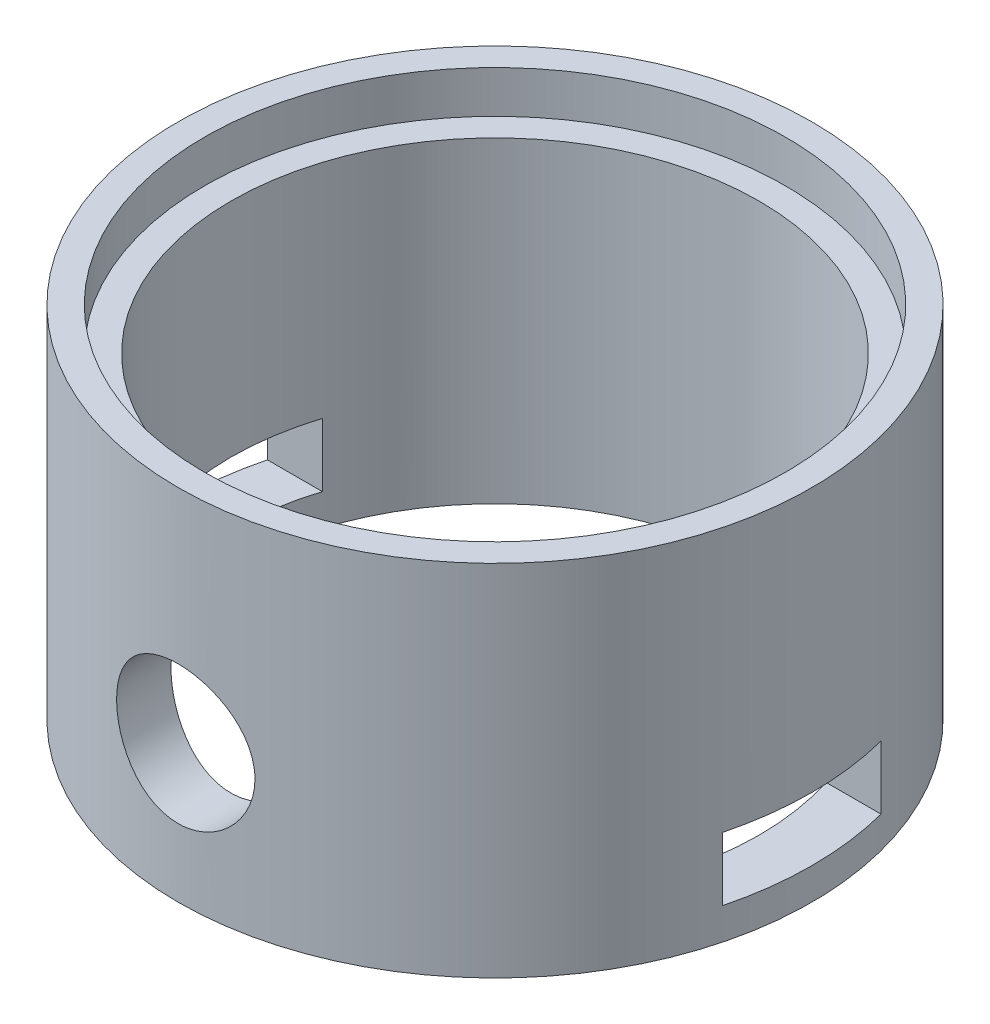
ISO-10303-21;
HEADER;
FILE_DESCRIPTION(('STEP AP214'),'2;1');
FILE_NAME('part.step','',(''),(''),'','','');
FILE_SCHEMA(('AUTOMOTIVE_DESIGN { 1 0 10303 214 1 1 1 1 }'));
ENDSEC;
DATA;
#1=APPLICATION_CONTEXT('core data for automotive mechanical design processes');
#2=APPLICATION_PROTOCOL_DEFINITION('international standard','automotive_design',2000,#1);
#3=PRODUCT_CONTEXT('',#1,'mechanical');
#4=PRODUCT('Part','Part','',(#3));
#5=PRODUCT_RELATED_PRODUCT_CATEGORY('part','',(#4));
#6=PRODUCT_DEFINITION_FORMATION('','',#4);
#7=PRODUCT_DEFINITION_CONTEXT('part definition',#1,'design');
#8=PRODUCT_DEFINITION('design','',#6,#7);
#9=PRODUCT_DEFINITION_SHAPE('','',#8);
#10=(LENGTH_UNIT() NAMED_UNIT(*) SI_UNIT(.MILLI.,.METRE.));
#11=(NAMED_UNIT(*) PLANE_ANGLE_UNIT() SI_UNIT($,.RADIAN.));
#12=(NAMED_UNIT(*) SI_UNIT($,.STERADIAN.) SOLID_ANGLE_UNIT());
#13=UNCERTAINTY_MEASURE_WITH_UNIT(LENGTH_MEASURE(1.E-05),#10,'distance_accuracy_value','');
#14=(GEOMETRIC_REPRESENTATION_CONTEXT(3) GLOBAL_UNCERTAINTY_ASSIGNED_CONTEXT((#13)) GLOBAL_UNIT_ASSIGNED_CONTEXT((#10,
#11,#12)) REPRESENTATION_CONTEXT('',''));
#15=CARTESIAN_POINT('',(0.,0.,0.));
#16=DIRECTION('',(0.,0.,1.));
#17=DIRECTION('',(1.,0.,0.));
#18=AXIS2_PLACEMENT_3D('',#15,#16,#17);
#19=CARTESIAN_POINT('',(0.,0.,17.));
#20=DIRECTION('',(0.,0.,1.));
#21=DIRECTION('',(1.,0.,0.));
#22=AXIS2_PLACEMENT_3D('',#19,#20,#21);
#23=CYLINDRICAL_SURFACE('',#22,6.55);
#24=CARTESIAN_POINT('',(6.55,0.,24.1266968315184));
#25=CARTESIAN_POINT('',(6.55000601938717,-0.180594876208169,24.1266925935757));
#26=CARTESIAN_POINT('',(6.54253011188367,-0.36112674787558,24.1287278120837));
#27=CARTESIAN_POINT('',(6.51270557582662,-0.720918136796614,24.1367963345364));
#28=CARTESIAN_POINT('',(6.49035546618676,-0.900177525547133,24.1428300366264));
#29=CARTESIAN_POINT('',(6.4309608582975,-1.25611198455702,24.1587184316833));
#30=CARTESIAN_POINT('',(6.39391238640076,-1.43278634255951,24.1685741579039));
#31=CARTESIAN_POINT('',(6.30542076347325,-1.78232447219897,24.1918118781253));
#32=CARTESIAN_POINT('',(6.25397227924573,-1.95518680637509,24.2051951784934));
#33=CARTESIAN_POINT('',(6.13720765878002,-2.29553781915051,24.2350634889866));
#34=CARTESIAN_POINT('',(6.07191626151604,-2.46303547842014,24.2515429599741));
#35=CARTESIAN_POINT('',(5.9278919166737,-2.79192443529475,24.2871488609783));
#36=CARTESIAN_POINT('',(5.84915399595804,-2.95331344656732,24.3062762698258));
#37=CARTESIAN_POINT('',(5.67884812680334,-3.26883787508116,24.3466287522206));
#38=CARTESIAN_POINT('',(5.58728449130416,-3.42297570751692,24.3678531199134));
#39=CARTESIAN_POINT('',(5.39194468751972,-3.72310900171406,24.4118201738481));
#40=CARTESIAN_POINT('',(5.28816385276374,-3.86910132063501,24.4345634388022));
#41=CARTESIAN_POINT('',(4.95480649686479,-4.29950540929866,24.505145793455));
#42=CARTESIAN_POINT('',(4.70678818154904,-4.56971802744325,24.5544518045554));
#43=CARTESIAN_POINT('',(4.16896539047249,-5.06516643102198,24.6514522974248));
#44=CARTESIAN_POINT('',(3.87915671241005,-5.29039768783942,24.6991466165313));
#45=CARTESIAN_POINT('',(3.41667260565014,-5.59137884524107,24.7659299985457));
#46=CARTESIAN_POINT('',(3.25647317735121,-5.6861732318591,24.7875528603862));
#47=CARTESIAN_POINT('',(2.92837783540687,-5.86188366038502,24.8284487721247));
#48=CARTESIAN_POINT('',(2.76048496012666,-5.94280512225976,24.84772273885));
#49=CARTESIAN_POINT('',(2.41811271832715,-6.09015486669224,24.8833754405409));
#50=CARTESIAN_POINT('',(2.24363156399467,-6.15657918162544,24.8997533826813));
#51=CARTESIAN_POINT('',(1.88944596494439,-6.27433671992704,24.9291305116473));
#52=CARTESIAN_POINT('',(1.70974373633504,-6.32567624617018,24.9421311093644));
#53=CARTESIAN_POINT('',(1.35034765757113,-6.41190033294915,24.9641396016482));
#54=CARTESIAN_POINT('',(1.17073883042341,-6.44711885682846,24.9732282728758));
#55=CARTESIAN_POINT('',(0.809120770489915,-6.50240453081884,24.9875579095762));
#56=CARTESIAN_POINT('',(0.627112496737917,-6.52247755815631,24.9928003675544));
#57=CARTESIAN_POINT('',(0.26197474124326,-6.54731677394672,24.9992942463497));
#58=CARTESIAN_POINT('',(0.078845207370329,-6.55208224521396,25.0005454801711));
#59=CARTESIAN_POINT('',(-0.287151538970289,-6.54626148490125,24.9990206026687));
#60=CARTESIAN_POINT('',(-0.470018755001871,-6.5356754639051,24.9962445465893));
#61=CARTESIAN_POINT('',(-0.829644973368947,-6.49969542775415,24.9868615387811));
#62=CARTESIAN_POINT('',(-1.00644366598999,-6.47467160552913,24.9803503802288));
#63=CARTESIAN_POINT('',(-1.35730663303472,-6.41030742151709,24.9637452120234));
#64=CARTESIAN_POINT('',(-1.53136994733257,-6.37096214498983,24.9536499724386));
#65=CARTESIAN_POINT('',(-1.87544152002361,-6.27829220572894,24.9301513626785));
#66=CARTESIAN_POINT('',(-2.04545108703564,-6.22497212282547,24.9167490763741));
#67=CARTESIAN_POINT('',(-2.38039712653912,-6.10474269932834,24.8869843940933));
#68=CARTESIAN_POINT('',(-2.54533166656278,-6.03782825423978,24.8706208864721));
#69=CARTESIAN_POINT('',(-2.87049394683156,-5.89024098031549,24.8352020648357));
#70=CARTESIAN_POINT('',(-3.03066364085037,-5.80944597338691,24.8161231299057));
#71=CARTESIAN_POINT('',(-3.34369976933483,-5.63509382164558,24.7758872258166));
#72=CARTESIAN_POINT('',(-3.49656350601621,-5.54153201100332,24.754729497725));
#73=CARTESIAN_POINT('',(-3.79393584308822,-5.34233767042372,24.7109011892266));
#74=CARTESIAN_POINT('',(-3.93844612213168,-5.23670757843238,24.6882309147569));
#75=CARTESIAN_POINT('',(-4.21830367932799,-5.01402081919217,24.6419569288269));
#76=CARTESIAN_POINT('',(-4.3536474918961,-4.89695987064839,24.6183528696124));
#77=CARTESIAN_POINT('',(-4.61810556575205,-4.6485979700098,24.5701382876577));
#78=CARTESIAN_POINT('',(-4.74692064552861,-4.51698003965811,24.5455185517602));
#79=CARTESIAN_POINT('',(-4.99308838287272,-4.24328389080865,24.4966288740423));
#80=CARTESIAN_POINT('',(-5.11043696403482,-4.10120198356079,24.4723590592158));
#81=CARTESIAN_POINT('',(-5.33281444631996,-3.80755898011931,24.4248647884629));
#82=CARTESIAN_POINT('',(-5.4378445335405,-3.65599879870812,24.4016402320257));
#83=CARTESIAN_POINT('',(-5.63485416164743,-3.34438287700196,24.3569010054972));
#84=CARTESIAN_POINT('',(-5.72683393015299,-3.18432728494793,24.3353863055861));
#85=CARTESIAN_POINT('',(-5.897573926671,-2.85580046111477,24.2945750589139));
#86=CARTESIAN_POINT('',(-5.9762514706821,-2.68728447234089,24.2752926051941));
#87=CARTESIAN_POINT('',(-6.11905949569371,-2.34396314946865,24.2396891285909));
#88=CARTESIAN_POINT('',(-6.18319520184952,-2.16916010067051,24.2233670424151));
#89=CARTESIAN_POINT('',(-6.2964177777768,-1.8144638623521,24.1941841129112));
#90=CARTESIAN_POINT('',(-6.34550483350079,-1.6345707357587,24.1813232268141));
#91=CARTESIAN_POINT('',(-6.42819789536786,-1.2710305091902,24.1594723665185));
#92=CARTESIAN_POINT('',(-6.46180433735365,-1.08738351505392,24.1504822833415));
#93=CARTESIAN_POINT('',(-6.51248248958714,-0.723116603948739,24.1368647341248));
#94=CARTESIAN_POINT('',(-6.5300066564965,-0.542563984055307,24.1321179935409));
#95=CARTESIAN_POINT('',(-6.55002302032024,-0.180501473901488,24.1266928461488));
#96=CARTESIAN_POINT('',(-6.55251002456587,0.00100872537890754,24.1260158447132));
#97=CARTESIAN_POINT('',(-6.54241788104239,0.363495256640244,24.1287545220356));
#98=CARTESIAN_POINT('',(-6.52984556348666,0.544471793356697,24.1321683453845));
#99=CARTESIAN_POINT('',(-6.48975076167251,0.904704363531271,24.1429816962022));
#100=CARTESIAN_POINT('',(-6.46222305309063,1.08395977347126,24.1503826164644));
#101=CARTESIAN_POINT('',(-6.39310477418758,1.43607152384794,24.1687703879605));
#102=CARTESIAN_POINT('',(-6.35178554325923,1.60898486732591,24.1796879173225));
#103=CARTESIAN_POINT('',(-6.25531202128629,1.95066272731894,24.2048250078585));
#104=CARTESIAN_POINT('',(-6.20015750643335,2.11942717667035,24.2190446224488));
#105=CARTESIAN_POINT('',(-6.07642762657287,2.45172776218292,24.2503834495907));
#106=CARTESIAN_POINT('',(-6.00784902340054,2.6152626257661,24.2675033616191));
#107=CARTESIAN_POINT('',(-5.85781015589773,2.93596536835557,24.3041564025541));
#108=CARTESIAN_POINT('',(-5.7763537898285,3.09313515612253,24.3236888007805));
#109=CARTESIAN_POINT('',(-5.59921630894917,3.40351163664649,24.3650820665715));
#110=CARTESIAN_POINT('',(-5.50326544334264,3.55655889418951,24.3869841854295));
#111=CARTESIAN_POINT('',(-5.29919913385414,3.85402536489867,24.4321386975574));
#112=CARTESIAN_POINT('',(-5.19108773174196,3.99844742051391,24.4553906409532));
#113=CARTESIAN_POINT('',(-4.96333319536695,4.27788846218462,24.5026294952634));
#114=CARTESIAN_POINT('',(-4.84368420450769,4.41290261215635,24.5266167751833));
#115=CARTESIAN_POINT('',(-4.59371425678154,4.67255336352645,24.5746613170224));
#116=CARTESIAN_POINT('',(-4.4633970120608,4.79719354448231,24.5987185518133));
#117=CARTESIAN_POINT('',(-4.18905409613531,5.03871594801198,24.6469422164958));
#118=CARTESIAN_POINT('',(-4.04474545639687,5.15528022056735,24.6710925896269));
#119=CARTESIAN_POINT('',(-3.7466823294386,5.37580011634555,24.7181132459125));
#120=CARTESIAN_POINT('',(-3.59293131004124,5.47976032732717,24.7409839931964));
#121=CARTESIAN_POINT('',(-3.27690407965258,5.67440309816753,24.7848210153602));
#122=CARTESIAN_POINT('',(-3.11462484146134,5.76508089941626,24.8057866066749));
#123=CARTESIAN_POINT('',(-2.78276598771142,5.93238811805206,24.84520312583));
#124=CARTESIAN_POINT('',(-2.61318935898986,6.00902321686745,24.8636550698688));
#125=CARTESIAN_POINT('',(-2.26910168047121,6.14717832748489,24.8974063717134));
#126=CARTESIAN_POINT('',(-2.09463461909147,6.20880256699754,24.9127273421642));
#127=CARTESIAN_POINT('',(-1.74093202726376,6.31710771958717,24.939939873439));
#128=CARTESIAN_POINT('',(-1.56169836858504,6.36379440723708,24.9518327593185));
#129=CARTESIAN_POINT('',(-1.19971499041736,6.4418526385587,24.9718549678561));
#130=CARTESIAN_POINT('',(-1.01696521869064,6.47322395451198,24.9799842345543));
#131=CARTESIAN_POINT('',(-0.649332995836877,6.52036870727214,24.9922425545383));
#132=CARTESIAN_POINT('',(-0.464450596857607,6.5361425246602,24.9963717054275));
#133=CARTESIAN_POINT('',(-0.0995012589882392,6.55171401402035,25.0004480792076));
#134=CARTESIAN_POINT('',(0.0805447481376994,6.55197437135315,25.0005164148068));
#135=CARTESIAN_POINT('',(0.440070162061065,6.53767650704732,24.9967731129077));
#136=CARTESIAN_POINT('',(0.619549352281458,6.52311318004869,24.9929601386646));
#137=CARTESIAN_POINT('',(0.976507628845156,6.47929437077588,24.9815593900028));
#138=CARTESIAN_POINT('',(1.15398749860842,6.450044863549,24.9739731507423));
#139=CARTESIAN_POINT('',(1.50582597549354,6.37709013564963,24.955230651129));
#140=CARTESIAN_POINT('',(1.68018339744796,6.33337954372942,24.9440730643289));
#141=CARTESIAN_POINT('',(2.02331990622904,6.23221096222914,24.9185789370878));
#142=CARTESIAN_POINT('',(2.19212895576622,6.17484888966026,24.9042646254957));
#143=CARTESIAN_POINT('',(2.52433814038525,6.0466460326121,24.8727876992133));
#144=CARTESIAN_POINT('',(2.68773640589225,5.97580064516756,24.855624112087));
#145=CARTESIAN_POINT('',(3.00799501633352,5.82117538966843,24.8189029978049));
#146=CARTESIAN_POINT('',(3.16485585342177,5.73739649752235,24.7993456512953));
#147=CARTESIAN_POINT('',(3.47107130749624,5.5574904304248,24.7583426595685));
#148=CARTESIAN_POINT('',(3.62042570532534,5.46136289523482,24.7368969592695));
#149=CARTESIAN_POINT('',(3.9144956907026,5.25474558251159,24.6920922506482));
#150=CARTESIAN_POINT('',(4.0589887575669,5.14394665451508,24.6686979327962));
#151=CARTESIAN_POINT('',(4.3381352922417,4.91081876763968,24.621141869057));
#152=CARTESIAN_POINT('',(4.47279184448681,4.7884934508795,24.5969803671747));
#153=CARTESIAN_POINT('',(4.73153533979084,4.53300648721832,24.5485215744625));
#154=CARTESIAN_POINT('',(4.85561593431127,4.39983842410171,24.5242242112729));
#155=CARTESIAN_POINT('',(5.09226890461464,4.12363429745072,24.4761797384075));
#156=CARTESIAN_POINT('',(5.20484539571047,3.98060179356393,24.4524324343291));
#157=CARTESIAN_POINT('',(5.4200747045184,3.68236681911702,24.4056383271166));
#158=CARTESIAN_POINT('',(5.5224629117637,3.52696913244821,24.3826174702056));
#159=CARTESIAN_POINT('',(5.71371821567442,3.20788303174417,24.3385097096281));
#160=CARTESIAN_POINT('',(5.80259027161906,3.04419768810112,24.3174220977584));
#161=CARTESIAN_POINT('',(5.96614727360293,2.70965463940036,24.2778124071171));
#162=CARTESIAN_POINT('',(6.04083776972913,2.53879977230011,24.2592893254643));
#163=CARTESIAN_POINT('',(6.17545381873824,2.19112832631811,24.2253703086293));
#164=CARTESIAN_POINT('',(6.23538145112957,2.01431259108243,24.2099739330706));
#165=CARTESIAN_POINT('',(6.3743513874178,1.53809271643095,24.1738666594176));
#166=CARTESIAN_POINT('',(6.44009619502822,1.2344484923474,24.1563069816223));
#167=CARTESIAN_POINT('',(6.52791303586741,0.620473768361946,24.1327263135029));
#168=CARTESIAN_POINT('',(6.54998966262662,0.310143975198479,24.1267041095343));
#169=CARTESIAN_POINT('',(6.55,0.,24.1266968315184));
#170=B_SPLINE_CURVE_WITH_KNOTS('',3,(#24,#25,#26,#27,#28,#29,#30,#31,#32,#33,#34,#35,#36,#37,
#38,#39,#40,#41,#42,#43,#44,#45,#46,#47,#48,#49,#50,#51,#52,#53,#54,#55,#56,#57,#58,#59,#60,#61,
#62,#63,#64,#65,#66,#67,#68,#69,#70,#71,#72,#73,#74,#75,#76,#77,#78,#79,#80,#81,#82,#83,#84,#85,
#86,#87,#88,#89,#90,#91,#92,#93,#94,#95,#96,#97,#98,#99,#100,#101,#102,#103,#104,#105,#106,#107,
#108,#109,#110,#111,#112,#113,#114,#115,#116,#117,#118,#119,#120,#121,#122,#123,#124,#125,#126,
#127,#128,#129,#130,#131,#132,#133,#134,#135,#136,#137,#138,#139,#140,#141,#142,#143,#144,#145,
#146,#147,#148,#149,#150,#151,#152,#153,#154,#155,#156,#157,#158,#159,#160,#161,#162,#163,#164,
#165,#166,#167,#168,#169),.UNSPECIFIED.,.T.,.F.,(4,2,2,2,2,2,2,2,2,2,2,2,2,2,2,2,2,2,2,2,2,2,2,
2,2,2,2,2,2,2,2,2,2,2,2,2,2,2,2,2,2,2,2,2,2,2,2,2,2,2,2,2,2,2,2,2,2,2,2,2,2,2,2,2,2,2,2,2,2,2,2,
2,4),(0.,0.541510206095643,1.08307434068898,1.62478498500046,2.16669652365693,2.7076476428143,
3.24879926536292,3.78976934822718,4.33094673410516,5.4357665504056,6.54069754133211,
7.10230963222431,7.66370180624353,8.22524743169645,8.78655809188736,9.33564624665217,
9.88452121742149,10.4334219035654,10.9823150602459,11.5177229902079,12.053314831353,
12.5887313670862,13.1243493171299,13.6649490514668,14.2057468883076,14.7464356696483,
15.287327742164,15.8440856834575,16.4010408406858,16.957942326873,17.5148340985821,
18.0750693781998,18.6351030346204,19.1951297705621,19.7551407384928,20.2988648271996,
20.8427766652827,21.3864419034401,21.9302971808307,22.4640278580146,22.9977671697216,
23.5316353892827,24.0653423085556,24.6106022573661,25.1556815119053,25.7010389254648,
26.2462073754896,26.8067516673384,27.3670913098954,27.9276312135671,28.4879438295858,
29.0442473080269,29.6003354695721,30.1564318991288,30.7125147595186,31.2520040114736,
31.7916791294402,32.3311348592049,32.8707911831555,33.4067622851669,33.9429166875035,
34.4790306536136,35.0151602629622,35.5652701770727,36.1152068461613,36.665471339994,
37.2155382959087,37.7774023590876,38.339059765927,38.900496907726,39.4618549197755,
40.3919134064493,41.3218740534804),.UNSPECIFIED.);
#171=CARTESIAN_POINT('',(6.55,0.,24.1266968315184));
#172=VERTEX_POINT('',#171);
#173=EDGE_CURVE('E140',#172,#172,#170,.T.);
#174=ORIENTED_EDGE('',*,*,#173,.T.);
#175=EDGE_LOOP('',(#174));
#176=FACE_BOUND('',#175,.T.);
#177=CARTESIAN_POINT('',(6.55,0.,29.2762275575252));
#178=CARTESIAN_POINT('',(6.55000421270252,-0.18165027174334,29.2762250620469));
#179=CARTESIAN_POINT('',(6.54244176401175,-0.363250437714547,29.2779212279109));
#180=CARTESIAN_POINT('',(6.51226254509112,-0.725186696773222,29.2846495439754));
#181=CARTESIAN_POINT('',(6.48964350681939,-0.905522595282089,29.2896821967656));
#182=CARTESIAN_POINT('',(6.42951611713506,-1.26365112427059,29.3029394769836));
#183=CARTESIAN_POINT('',(6.3920010293991,-1.44144256635207,29.3111655485083));
#184=CARTESIAN_POINT('',(6.30236847896812,-1.79321085988406,29.3305685901527));
#185=CARTESIAN_POINT('',(6.25024563239287,-1.96718627934962,29.3417466481777));
#186=CARTESIAN_POINT('',(6.13189888483996,-2.30978662467047,29.3667067224808));
#187=CARTESIAN_POINT('',(6.06569603152775,-2.47841910986398,29.3804848485891));
#188=CARTESIAN_POINT('',(5.91961510371476,-2.80952160427044,29.4102654187206));
#189=CARTESIAN_POINT('',(5.83973198175348,-2.9719893118079,29.4262686833175));
#190=CARTESIAN_POINT('',(5.66692283596385,-3.28955162561879,29.4600361330791));
#191=CARTESIAN_POINT('',(5.57400220410864,-3.44464924464847,29.4777995893869));
#192=CARTESIAN_POINT('',(5.37570595273769,-3.74658787320061,29.514605780123));
#193=CARTESIAN_POINT('',(5.27032567101372,-3.89342576153703,29.5336489922585));
#194=CARTESIAN_POINT('',(5.04620762836782,-4.17993461466561,29.5727731911943));
#195=CARTESIAN_POINT('',(4.92729570324722,-4.31946784441304,29.592865345248));
#196=CARTESIAN_POINT('',(4.67817087351832,-4.58811386151098,29.6332691887851));
#197=CARTESIAN_POINT('',(4.54795379446341,-4.71722276540786,29.653580956917));
#198=CARTESIAN_POINT('',(4.27716528439803,-4.96406192450261,29.6938475745461));
#199=CARTESIAN_POINT('',(4.13659684217902,-5.08179544163901,29.7138025250167));
#200=CARTESIAN_POINT('',(3.8459535855456,-5.30516218193903,29.7528174282872));
#201=CARTESIAN_POINT('',(3.69587528770451,-5.41079093091315,29.7718770486272));
#202=CARTESIAN_POINT('',(3.3856925689694,-5.61016184397464,29.8087523453697));
#203=CARTESIAN_POINT('',(3.22550195372006,-5.70377269681679,29.8265534577098));
#204=CARTESIAN_POINT('',(2.89753772616685,-5.87717653413327,29.8601987163685));
#205=CARTESIAN_POINT('',(2.72976129156836,-5.95696432151436,29.8760421260054));
#206=CARTESIAN_POINT('',(2.38791413301628,-6.10203224879859,29.9053044490812));
#207=CARTESIAN_POINT('',(2.21384633105731,-6.1673190254592,29.9187244711172));
#208=CARTESIAN_POINT('',(1.86062477190865,-6.28292937744307,29.9427713783286));
#209=CARTESIAN_POINT('',(1.68146920038075,-6.33324753953724,29.9533972528716));
#210=CARTESIAN_POINT('',(1.14396459655227,-6.45967510597269,29.9802896928797));
#211=CARTESIAN_POINT('',(0.779792004663071,-6.51370256564854,29.9920808975851));
#212=CARTESIAN_POINT('',(0.231078296137972,-6.54850522138111,29.999674807343));
#213=CARTESIAN_POINT('',(0.0476906364684509,-6.55239196534918,30.0005222757843));
#214=CARTESIAN_POINT('',(-0.318773911364855,-6.54480291971328,29.9988653365657));
#215=CARTESIAN_POINT('',(-0.501850795029068,-6.53332690954744,29.9963608807826));
#216=CARTESIAN_POINT('',(-1.04229079993075,-6.47654115021574,29.9840195986613));
#217=CARTESIAN_POINT('',(-1.39748643908586,-6.40927722218104,29.9694410924354));
#218=CARTESIAN_POINT('',(-2.09123656007393,-6.21763102383765,29.9290464667892));
#219=CARTESIAN_POINT('',(-2.42979029049316,-6.09324617702889,29.9032298404643));
#220=CARTESIAN_POINT('',(-3.08374867419236,-5.78997283233917,29.8429072219788));
#221=CARTESIAN_POINT('',(-3.39896639626684,-5.61069327118515,29.8083392023889));
#222=CARTESIAN_POINT('',(-3.99520546173385,-5.20301203978193,29.7343028502621));
#223=CARTESIAN_POINT('',(-4.27622215411079,-4.97460370014659,29.6948338527097));
#224=CARTESIAN_POINT('',(-4.80223033895394,-4.46953496804949,29.6143706163007));
#225=CARTESIAN_POINT('',(-5.04635410044559,-4.19197232970738,29.5733617207072));
#226=CARTESIAN_POINT('',(-5.48474966896818,-3.59942378382849,29.4952073619061));
#227=CARTESIAN_POINT('',(-5.67902013450106,-3.28443686957868,29.4580620026781));
#228=CARTESIAN_POINT('',(-6.01257960801508,-2.62458136289686,29.391802028971));
#229=CARTESIAN_POINT('',(-6.15170511377207,-2.27962755228691,29.3627113720468));
#230=CARTESIAN_POINT('',(-6.36975213298939,-1.57045146413173,29.3161869507352));
#231=CARTESIAN_POINT('',(-6.44868315868894,-1.20623224073711,29.298751344611));
#232=CARTESIAN_POINT('',(-6.54275574816145,-0.47679229899539,29.277886619001));
#233=CARTESIAN_POINT('',(-6.55916068337823,-0.111742255517795,29.2741801395062));
#234=CARTESIAN_POINT('',(-6.53113528066161,0.61587673773806,29.2804452249738));
#235=CARTESIAN_POINT('',(-6.48670910572872,0.978445855592934,29.2904158539382));
#236=CARTESIAN_POINT('',(-6.33937890460057,1.68641509857197,29.3226498358456));
#237=CARTESIAN_POINT('',(-6.23717028001545,2.03196721455225,29.3447669195319));
#238=CARTESIAN_POINT('',(-5.97792799069298,2.70104179055618,29.3986699426352));
#239=CARTESIAN_POINT('',(-5.82088909380183,3.02456214468686,29.430456804749));
#240=CARTESIAN_POINT('',(-5.45366367351605,3.6458569219011,29.5007273368436));
#241=CARTESIAN_POINT('',(-5.24269868447075,3.94316017354629,29.5393062718664));
#242=CARTESIAN_POINT('',(-4.77461064557812,4.49861178414967,29.6185631436956));
#243=CARTESIAN_POINT('',(-4.51748188523572,4.75675529171965,29.6592413397381));
#244=CARTESIAN_POINT('',(-3.95871725496048,5.23144253987426,29.7390252440377));
#245=CARTESIAN_POINT('',(-3.65634361140505,5.44712483217958,29.7780877282785));
#246=CARTESIAN_POINT('',(-3.01871554818005,5.82468004717711,29.8494527651249));
#247=CARTESIAN_POINT('',(-2.68346266204439,5.98655547795242,29.8817556327884));
#248=CARTESIAN_POINT('',(-2.16460074733234,6.18475365168967,29.9223101458058));
#249=CARTESIAN_POINT('',(-1.98947506193913,6.2432858606116,29.9344894493783));
#250=CARTESIAN_POINT('',(-1.63476028136557,6.34539628730927,29.9559515094723));
#251=CARTESIAN_POINT('',(-1.45517286419166,6.38898003839209,29.9652353376646));
#252=CARTESIAN_POINT('',(-1.09282431466319,6.46083359371111,29.9806378346758));
#253=CARTESIAN_POINT('',(-0.910062946334769,6.4891022542418,29.9867562671068));
#254=CARTESIAN_POINT('',(-0.542726002201627,6.5300914332192,29.9956528565016));
#255=CARTESIAN_POINT('',(-0.358150497757219,6.54281256079116,29.9984311443264));
#256=CARTESIAN_POINT('',(0.00760269769988631,6.55249693375306,30.0005449357156));
#257=CARTESIAN_POINT('',(0.188771583275297,6.54978110087727,29.9999505547445));
#258=CARTESIAN_POINT('',(0.550219203427632,6.52935849686493,29.9954983777975));
#259=CARTESIAN_POINT('',(0.73049795576805,6.51165202610756,29.9916406472119));
#260=CARTESIAN_POINT('',(1.08890449660197,6.46138827744298,29.9807677980317));
#261=CARTESIAN_POINT('',(1.26703193734429,6.42882863070375,29.9737521758089));
#262=CARTESIAN_POINT('',(1.61978304311182,6.34913283709383,29.9567600802299));
#263=CARTESIAN_POINT('',(1.79440793206963,6.30200187996769,29.9467846610913));
#264=CARTESIAN_POINT('',(2.1385103219633,6.19368354624177,29.9241778686065));
#265=CARTESIAN_POINT('',(2.3080011483195,6.1325368679294,29.9115541939838));
#266=CARTESIAN_POINT('',(2.64115060938945,5.99659735025358,29.8839798941122));
#267=CARTESIAN_POINT('',(2.80481127355184,5.9218093159673,29.869030088499));
#268=CARTESIAN_POINT('',(3.12534739343285,5.75908183971053,29.837194195293));
#269=CARTESIAN_POINT('',(3.2822199478065,5.67113684445036,29.8203072907949));
#270=CARTESIAN_POINT('',(3.58803370172067,5.48276896446147,29.785058363579));
#271=CARTESIAN_POINT('',(3.73697756559735,5.38235030964568,29.7666968416578));
#272=CARTESIAN_POINT('',(4.02882789744584,5.16763914330755,29.7286161965974));
#273=CARTESIAN_POINT('',(4.17156250032613,5.05311638732,29.7088777187695));
#274=CARTESIAN_POINT('',(4.44686699983368,4.81261586903801,29.6689184086632));
#275=CARTESIAN_POINT('',(4.5794404114604,4.68664210118776,29.6486977463865));
#276=CARTESIAN_POINT('',(4.83367562738467,4.42396964833872,29.6083123574939));
#277=CARTESIAN_POINT('',(4.95533084709788,4.28726458339324,29.5881476716456));
#278=CARTESIAN_POINT('',(5.18677799794185,4.00415436509761,29.5484537540014));
#279=CARTESIAN_POINT('',(5.2965742525624,3.85775277847997,29.5289242924453));
#280=CARTESIAN_POINT('',(5.50502022823763,3.55410008766021,29.4907805432702));
#281=CARTESIAN_POINT('',(5.60349631369096,3.39672766848547,29.4721824918537));
#282=CARTESIAN_POINT('',(5.78677795108957,3.07410320365596,29.4367442695052));
#283=CARTESIAN_POINT('',(5.87158853835816,2.90885408954282,29.4199034518953));
#284=CARTESIAN_POINT('',(6.02689861889938,2.57165714476786,29.388480332731));
#285=CARTESIAN_POINT('',(6.09740602907371,2.39971308297287,29.3738967828293));
#286=CARTESIAN_POINT('',(6.22359764852861,2.05032830670839,29.3474184986333));
#287=CARTESIAN_POINT('',(6.27928452192929,1.8728885865419,29.3355232811459));
#288=CARTESIAN_POINT('',(6.4010433107525,1.41786537995708,29.3092553107819));
#289=CARTESIAN_POINT('',(6.45681859024661,1.13733545144061,29.2969437974611));
#290=CARTESIAN_POINT('',(6.53129272720402,0.571162253163944,29.2804320782528));
#291=CARTESIAN_POINT('',(6.54999337844324,0.285519231464507,29.2762314799364));
#292=CARTESIAN_POINT('',(6.55,0.,29.2762275575252));
#293=B_SPLINE_CURVE_WITH_KNOTS('',3,(#177,#178,#179,#180,#181,#182,#183,#184,#185,#186,#187,
#188,#189,#190,#191,#192,#193,#194,#195,#196,#197,#198,#199,#200,#201,#202,#203,#204,#205,#206,
#207,#208,#209,#210,#211,#212,#213,#214,#215,#216,#217,#218,#219,#220,#221,#222,#223,#224,#225,
#226,#227,#228,#229,#230,#231,#232,#233,#234,#235,#236,#237,#238,#239,#240,#241,#242,#243,#244,
#245,#246,#247,#248,#249,#250,#251,#252,#253,#254,#255,#256,#257,#258,#259,#260,#261,#262,#263,
#264,#265,#266,#267,#268,#269,#270,#271,#272,#273,#274,#275,#276,#277,#278,#279,#280,#281,#282,
#283,#284,#285,#286,#287,#288,#289,#290,#291,#292),.UNSPECIFIED.,.T.,.F.,(4,2,2,2,2,2,2,2,2,2,2,
2,2,2,2,2,2,2,2,2,2,2,2,2,2,2,2,2,2,2,2,2,2,2,2,2,2,2,2,2,2,2,2,2,2,2,2,2,2,2,2,2,2,2,2,2,2,4),
(0.,0.544699425315716,1.08948091973115,1.6345090574962,2.17973833726861,2.72415823239897,
3.26877943071606,3.81317604825671,4.35777701913248,4.91041447743634,5.46325687307597,
6.01594026545994,6.56882728738358,7.1273174531081,7.68601714226428,8.2444605989383,
8.80310576550337,9.90172732820997,10.4514787221063,11.0012380088256,12.0811091960801,
13.1610290968634,14.2488286228923,15.3367759144337,16.4472801518405,17.5578142685775,
18.671616868659,19.7852434234719,20.8762454912806,21.9671728996732,23.045242446583,
24.123414895918,25.218129517027,26.3129796486219,27.4281594602792,28.5432872831024,
29.0978772657,29.6522617396771,30.2066876084609,30.7610917551089,31.3040130220597,
31.8469234103284,32.3899204139699,32.9327242451651,33.4739714360504,34.0150283430921,
34.5563142671027,35.0974171354827,35.6489570103881,36.2003052251795,36.7519837455656,
37.3034604536331,37.8625048744539,38.4213428308904,38.9798706177837,39.5382979365433,
40.3945019210173,41.2506644788969),.UNSPECIFIED.);
#294=CARTESIAN_POINT('',(6.55,0.,29.2762275575252));
#295=VERTEX_POINT('',#294);
#296=EDGE_CURVE('E42',#295,#295,#293,.T.);
#297=ORIENTED_EDGE('',*,*,#296,.F.);
#298=EDGE_LOOP('',(#297));
#299=FACE_BOUND('',#298,.T.);
#300=ADVANCED_FACE('F38',(#176,#299),#23,.F.);
#301=CARTESIAN_POINT('',(0.,10.,0.));
#302=DIRECTION('',(0.,-1.,0.));
#303=DIRECTION('',(0.,0.,-1.));
#304=AXIS2_PLACEMENT_3D('',#301,#302,#303);
#305=CYLINDRICAL_SURFACE('',#304,25.);
#306=DIRECTION('',(0.,-1.,0.));
#307=VECTOR('',#306,1.);
#308=CARTESIAN_POINT('',(-23.8484800354236,10.,7.5));
#309=LINE('',#308,#307);
#310=CARTESIAN_POINT('',(-23.8484800354236,-3.99999999999998,7.5));
#311=VERTEX_POINT('',#310);
#312=CARTESIAN_POINT('',(-23.8484800354236,-9.99999999999998,7.5));
#313=VERTEX_POINT('',#312);
#314=EDGE_CURVE('E190',#311,#313,#309,.T.);
#315=ORIENTED_EDGE('',*,*,#314,.F.);
#316=CARTESIAN_POINT('',(0.,-3.99999999999998,0.));
#317=DIRECTION('',(0.,1.,0.));
#318=DIRECTION('',(0.,0.,1.));
#319=AXIS2_PLACEMENT_3D('',#316,#317,#318);
#320=CIRCLE('',#319,25.);
#321=CARTESIAN_POINT('',(-23.8484800354236,-3.99999999999998,-7.5));
#322=VERTEX_POINT('',#321);
#323=EDGE_CURVE('E192',#322,#311,#320,.T.);
#324=ORIENTED_EDGE('',*,*,#323,.F.);
#325=DIRECTION('',(0.,-1.,0.));
#326=VECTOR('',#325,1.);
#327=CARTESIAN_POINT('',(-23.8484800354236,10.,-7.5));
#328=LINE('',#327,#326);
#329=CARTESIAN_POINT('',(-23.8484800354236,-9.99999999999998,-7.5));
#330=VERTEX_POINT('',#329);
#331=EDGE_CURVE('E195',#330,#322,#328,.F.);
#332=ORIENTED_EDGE('',*,*,#331,.F.);
#333=CARTESIAN_POINT('',(0.,-9.99999999999998,0.));
#334=DIRECTION('',(0.,-1.,0.));
#335=DIRECTION('',(0.,0.,-1.));
#336=AXIS2_PLACEMENT_3D('',#333,#334,#335);
#337=CIRCLE('',#336,25.);
#338=EDGE_CURVE('E60',#313,#330,#337,.T.);
#339=ORIENTED_EDGE('',*,*,#338,.F.);
#340=EDGE_LOOP('',(#315,#324,#332,#339));
#341=FACE_BOUND('',#340,.T.);
#342=CARTESIAN_POINT('',(0.,-9.99999999999998,0.));
#343=DIRECTION('',(0.,-1.,0.));
#344=DIRECTION('',(0.,0.,-1.));
#345=AXIS2_PLACEMENT_3D('',#342,#343,#344);
#346=CIRCLE('',#345,25.);
#347=CARTESIAN_POINT('',(23.8484800354236,-9.99999999999998,-7.5));
#348=VERTEX_POINT('',#347);
#349=CARTESIAN_POINT('',(23.8484800354236,-9.99999999999998,7.5));
#350=VERTEX_POINT('',#349);
#351=EDGE_CURVE('E107',#348,#350,#346,.T.);
#352=ORIENTED_EDGE('',*,*,#351,.F.);
#353=DIRECTION('',(0.,-1.,0.));
#354=VECTOR('',#353,1.);
#355=CARTESIAN_POINT('',(23.8484800354236,10.,-7.5));
#356=LINE('',#355,#354);
#357=CARTESIAN_POINT('',(23.8484800354236,-3.99999999999998,-7.5));
#358=VERTEX_POINT('',#357);
#359=EDGE_CURVE('E111',#358,#348,#356,.T.);
#360=ORIENTED_EDGE('',*,*,#359,.F.);
#361=CARTESIAN_POINT('',(0.,-3.99999999999998,0.));
#362=DIRECTION('',(0.,1.,0.));
#363=DIRECTION('',(0.,0.,1.));
#364=AXIS2_PLACEMENT_3D('',#361,#362,#363);
#365=CIRCLE('',#364,25.);
#366=CARTESIAN_POINT('',(23.8484800354236,-3.99999999999998,7.5));
#367=VERTEX_POINT('',#366);
#368=EDGE_CURVE('E125',#367,#358,#365,.T.);
#369=ORIENTED_EDGE('',*,*,#368,.F.);
#370=DIRECTION('',(0.,-1.,0.));
#371=VECTOR('',#370,1.);
#372=CARTESIAN_POINT('',(23.8484800354236,10.,7.5));
#373=LINE('',#372,#371);
#374=EDGE_CURVE('E68',#350,#367,#373,.F.);
#375=ORIENTED_EDGE('',*,*,#374,.F.);
#376=EDGE_LOOP('',(#352,#360,#369,#375));
#377=FACE_BOUND('',#376,.T.);
#378=ORIENTED_EDGE('',*,*,#173,.F.);
#379=EDGE_LOOP('',(#378));
#380=FACE_BOUND('',#379,.T.);
#381=CARTESIAN_POINT('',(0.,17.,0.));
#382=DIRECTION('',(0.,1.,0.));
#383=DIRECTION('',(0.,0.,1.));
#384=AXIS2_PLACEMENT_3D('',#381,#382,#383);
#385=CIRCLE('',#384,25.);
#386=CARTESIAN_POINT('',(0.,17.,25.));
#387=VERTEX_POINT('',#386);
#388=EDGE_CURVE('E146',#387,#387,#385,.T.);
#389=ORIENTED_EDGE('',*,*,#388,.T.);
#390=EDGE_LOOP('',(#389));
#391=FACE_BOUND('',#390,.T.);
#392=CARTESIAN_POINT('',(0.,-13.,0.));
#393=DIRECTION('',(0.,-1.,0.));
#394=DIRECTION('',(0.,0.,-1.));
#395=AXIS2_PLACEMENT_3D('',#392,#393,#394);
#396=CIRCLE('',#395,25.);
#397=CARTESIAN_POINT('',(0.,-13.,-25.));
#398=VERTEX_POINT('',#397);
#399=EDGE_CURVE('E116',#398,#398,#396,.T.);
#400=ORIENTED_EDGE('',*,*,#399,.T.);
#401=EDGE_LOOP('',(#400));
#402=FACE_BOUND('',#401,.T.);
#403=ADVANCED_FACE('F109',(#341,#377,#380,#391,#402),#305,.F.);
#404=CARTESIAN_POINT('',(0.,-13.,0.));
#405=DIRECTION('',(0.,1.,0.));
#406=DIRECTION('',(0.,0.,1.));
#407=AXIS2_PLACEMENT_3D('',#404,#405,#406);
#408=CYLINDRICAL_SURFACE('',#407,30.);
#409=CARTESIAN_POINT('',(0.,-13.,0.));
#410=DIRECTION('',(0.,1.,0.));
#411=DIRECTION('',(0.,0.,1.));
#412=AXIS2_PLACEMENT_3D('',#409,#410,#411);
#413=CIRCLE('',#412,30.);
#414=CARTESIAN_POINT('',(0.,-13.,30.));
#415=VERTEX_POINT('',#414);
#416=EDGE_CURVE('E139',#415,#415,#413,.T.);
#417=ORIENTED_EDGE('',*,*,#416,.T.);
#418=EDGE_LOOP('',(#417));
#419=FACE_BOUND('',#418,.T.);
#420=CARTESIAN_POINT('',(0.,21.,0.));
#421=DIRECTION('',(0.,1.,0.));
#422=DIRECTION('',(0.,0.,1.));
#423=AXIS2_PLACEMENT_3D('',#420,#421,#422);
#424=CIRCLE('',#423,30.);
#425=CARTESIAN_POINT('',(0.,21.,30.));
#426=VERTEX_POINT('',#425);
#427=EDGE_CURVE('E219',#426,#426,#424,.T.);
#428=ORIENTED_EDGE('',*,*,#427,.F.);
#429=EDGE_LOOP('',(#428));
#430=FACE_BOUND('',#429,.T.);
#431=CARTESIAN_POINT('',(0.,-9.99999999999998,0.));
#432=DIRECTION('',(0.,1.,0.));
#433=DIRECTION('',(0.,0.,1.));
#434=AXIS2_PLACEMENT_3D('',#431,#432,#433);
#435=CIRCLE('',#434,30.);
#436=CARTESIAN_POINT('',(29.0473750965556,-9.99999999999998,-7.5));
#437=VERTEX_POINT('',#436);
#438=CARTESIAN_POINT('',(29.0473750965556,-9.99999999999998,7.5));
#439=VERTEX_POINT('',#438);
#440=EDGE_CURVE('E129',#437,#439,#435,.F.);
#441=ORIENTED_EDGE('',*,*,#440,.T.);
#442=DIRECTION('',(0.,1.,0.));
#443=VECTOR('',#442,1.);
#444=CARTESIAN_POINT('',(29.0473750965556,-13.,7.5));
#445=LINE('',#444,#443);
#446=CARTESIAN_POINT('',(29.0473750965556,-3.99999999999998,7.5));
#447=VERTEX_POINT('',#446);
#448=EDGE_CURVE('E210',#439,#447,#445,.T.);
#449=ORIENTED_EDGE('',*,*,#448,.T.);
#450=CARTESIAN_POINT('',(0.,-3.99999999999998,0.));
#451=DIRECTION('',(0.,-1.,0.));
#452=DIRECTION('',(0.,0.,-1.));
#453=AXIS2_PLACEMENT_3D('',#450,#451,#452);
#454=CIRCLE('',#453,30.);
#455=CARTESIAN_POINT('',(29.0473750965556,-3.99999999999998,-7.5));
#456=VERTEX_POINT('',#455);
#457=EDGE_CURVE('E199',#447,#456,#454,.F.);
#458=ORIENTED_EDGE('',*,*,#457,.T.);
#459=DIRECTION('',(0.,1.,0.));
#460=VECTOR('',#459,1.);
#461=CARTESIAN_POINT('',(29.0473750965556,-13.,-7.5));
#462=LINE('',#461,#460);
#463=EDGE_CURVE('E206',#456,#437,#462,.F.);
#464=ORIENTED_EDGE('',*,*,#463,.T.);
#465=EDGE_LOOP('',(#441,#449,#458,#464));
#466=FACE_BOUND('',#465,.T.);
#467=CARTESIAN_POINT('',(-29.0473750965556,-3.99999999999998,-7.5));
#468=VERTEX_POINT('',#467);
#469=CARTESIAN_POINT('',(-29.0473750965556,-3.99999999999998,7.5));
#470=VERTEX_POINT('',#469);
#471=EDGE_CURVE('E202',#468,#470,#454,.F.);
#472=ORIENTED_EDGE('',*,*,#471,.T.);
#473=DIRECTION('',(0.,1.,0.));
#474=VECTOR('',#473,1.);
#475=CARTESIAN_POINT('',(-29.0473750965556,-13.,7.5));
#476=LINE('',#475,#474);
#477=CARTESIAN_POINT('',(-29.0473750965556,-9.99999999999998,7.5));
#478=VERTEX_POINT('',#477);
#479=EDGE_CURVE('E213',#470,#478,#476,.F.);
#480=ORIENTED_EDGE('',*,*,#479,.T.);
#481=CARTESIAN_POINT('',(-29.0473750965556,-9.99999999999998,-7.5));
#482=VERTEX_POINT('',#481);
#483=EDGE_CURVE('E209',#478,#482,#435,.F.);
#484=ORIENTED_EDGE('',*,*,#483,.T.);
#485=DIRECTION('',(0.,1.,0.));
#486=VECTOR('',#485,1.);
#487=CARTESIAN_POINT('',(-29.0473750965556,-13.,-7.5));
#488=LINE('',#487,#486);
#489=EDGE_CURVE('E203',#482,#468,#488,.T.);
#490=ORIENTED_EDGE('',*,*,#489,.T.);
#491=EDGE_LOOP('',(#472,#480,#484,#490));
#492=FACE_BOUND('',#491,.T.);
#493=ORIENTED_EDGE('',*,*,#296,.T.);
#494=EDGE_LOOP('',(#493));
#495=FACE_BOUND('',#494,.T.);
#496=ADVANCED_FACE('F155',(#419,#430,#466,#492,#495),#408,.T.);
#497=CARTESIAN_POINT('',(0.,17.,0.));
#498=DIRECTION('',(0.,1.,0.));
#499=DIRECTION('',(0.,0.,1.));
#500=AXIS2_PLACEMENT_3D('',#497,#498,#499);
#501=PLANE('',#500);
#502=ORIENTED_EDGE('',*,*,#388,.F.);
#503=EDGE_LOOP('',(#502));
#504=FACE_BOUND('',#503,.T.);
#505=CARTESIAN_POINT('',(0.,17.,0.));
#506=DIRECTION('',(0.,1.,0.));
#507=DIRECTION('',(0.,0.,1.));
#508=AXIS2_PLACEMENT_3D('',#505,#506,#507);
#509=CIRCLE('',#508,27.5);
#510=CARTESIAN_POINT('',(0.,17.,27.5));
#511=VERTEX_POINT('',#510);
#512=EDGE_CURVE('E222',#511,#511,#509,.T.);
#513=ORIENTED_EDGE('',*,*,#512,.T.);
#514=EDGE_LOOP('',(#513));
#515=FACE_BOUND('',#514,.T.);
#516=ADVANCED_FACE('F40',(#504,#515),#501,.T.);
#517=CARTESIAN_POINT('',(0.,-13.,0.));
#518=DIRECTION('',(0.,-1.,0.));
#519=DIRECTION('',(0.,0.,-1.));
#520=AXIS2_PLACEMENT_3D('',#517,#518,#519);
#521=PLANE('',#520);
#522=ORIENTED_EDGE('',*,*,#399,.F.);
#523=EDGE_LOOP('',(#522));
#524=FACE_BOUND('',#523,.T.);
#525=ORIENTED_EDGE('',*,*,#416,.F.);
#526=EDGE_LOOP('',(#525));
#527=FACE_BOUND('',#526,.T.);
#528=ADVANCED_FACE('F168',(#524,#527),#521,.T.);
#529=CARTESIAN_POINT('',(-35.,-9.99999999999998,7.5));
#530=DIRECTION('',(0.,-1.,0.));
#531=DIRECTION('',(0.,0.,-1.));
#532=AXIS2_PLACEMENT_3D('',#529,#530,#531);
#533=PLANE('',#532);
#534=DIRECTION('',(1.,0.,0.));
#535=VECTOR('',#534,1.);
#536=CARTESIAN_POINT('',(-35.,-9.99999999999998,7.5));
#537=LINE('',#536,#535);
#538=EDGE_CURVE('E132',#478,#313,#537,.T.);
#539=ORIENTED_EDGE('',*,*,#538,.T.);
#540=ORIENTED_EDGE('',*,*,#338,.T.);
#541=DIRECTION('',(1.,0.,0.));
#542=VECTOR('',#541,1.);
#543=CARTESIAN_POINT('',(-35.,-9.99999999999998,-7.5));
#544=LINE('',#543,#542);
#545=EDGE_CURVE('E131',#482,#330,#544,.T.);
#546=ORIENTED_EDGE('',*,*,#545,.F.);
#547=ORIENTED_EDGE('',*,*,#483,.F.);
#548=EDGE_LOOP('',(#539,#540,#546,#547));
#549=FACE_BOUND('',#548,.T.);
#550=ADVANCED_FACE('F250',(#549),#533,.F.);
#551=CARTESIAN_POINT('',(-35.,-3.99999999999998,-7.5));
#552=DIRECTION('',(0.,0.,-1.));
#553=DIRECTION('',(0.,1.,0.));
#554=AXIS2_PLACEMENT_3D('',#551,#552,#553);
#555=PLANE('',#554);
#556=ORIENTED_EDGE('',*,*,#545,.T.);
#557=ORIENTED_EDGE('',*,*,#331,.T.);
#558=DIRECTION('',(1.,0.,0.));
#559=VECTOR('',#558,1.);
#560=CARTESIAN_POINT('',(-35.,-3.99999999999998,-7.5));
#561=LINE('',#560,#559);
#562=EDGE_CURVE('E225',#468,#322,#561,.T.);
#563=ORIENTED_EDGE('',*,*,#562,.F.);
#564=ORIENTED_EDGE('',*,*,#489,.F.);
#565=EDGE_LOOP('',(#556,#557,#563,#564));
#566=FACE_BOUND('',#565,.T.);
#567=ADVANCED_FACE('F255',(#566),#555,.F.);
#568=CARTESIAN_POINT('',(-35.,-3.99999999999998,7.5));
#569=DIRECTION('',(0.,1.,0.));
#570=DIRECTION('',(0.,0.,1.));
#571=AXIS2_PLACEMENT_3D('',#568,#569,#570);
#572=PLANE('',#571);
#573=ORIENTED_EDGE('',*,*,#562,.T.);
#574=ORIENTED_EDGE('',*,*,#323,.T.);
#575=DIRECTION('',(1.,0.,0.));
#576=VECTOR('',#575,1.);
#577=CARTESIAN_POINT('',(-35.,-3.99999999999998,7.5));
#578=LINE('',#577,#576);
#579=EDGE_CURVE('E11',#470,#311,#578,.T.);
#580=ORIENTED_EDGE('',*,*,#579,.F.);
#581=ORIENTED_EDGE('',*,*,#471,.F.);
#582=EDGE_LOOP('',(#573,#574,#580,#581));
#583=FACE_BOUND('',#582,.T.);
#584=ADVANCED_FACE('F245',(#583),#572,.F.);
#585=CARTESIAN_POINT('',(-35.,-3.99999999999998,7.5));
#586=DIRECTION('',(0.,0.,1.));
#587=DIRECTION('',(0.,-1.,0.));
#588=AXIS2_PLACEMENT_3D('',#585,#586,#587);
#589=PLANE('',#588);
#590=ORIENTED_EDGE('',*,*,#579,.T.);
#591=ORIENTED_EDGE('',*,*,#314,.T.);
#592=ORIENTED_EDGE('',*,*,#538,.F.);
#593=ORIENTED_EDGE('',*,*,#479,.F.);
#594=EDGE_LOOP('',(#590,#591,#592,#593));
#595=FACE_BOUND('',#594,.T.);
#596=ADVANCED_FACE('F239',(#595),#589,.F.);
#597=EDGE_CURVE('E136',#350,#439,#537,.T.);
#598=ORIENTED_EDGE('',*,*,#597,.F.);
#599=ORIENTED_EDGE('',*,*,#374,.T.);
#600=EDGE_CURVE('E52',#367,#447,#578,.T.);
#601=ORIENTED_EDGE('',*,*,#600,.T.);
#602=ORIENTED_EDGE('',*,*,#448,.F.);
#603=EDGE_LOOP('',(#598,#599,#601,#602));
#604=FACE_BOUND('',#603,.T.);
#605=ADVANCED_FACE('F237',(#604),#589,.F.);
#606=ORIENTED_EDGE('',*,*,#600,.F.);
#607=ORIENTED_EDGE('',*,*,#368,.T.);
#608=EDGE_CURVE('E124',#358,#456,#561,.T.);
#609=ORIENTED_EDGE('',*,*,#608,.T.);
#610=ORIENTED_EDGE('',*,*,#457,.F.);
#611=EDGE_LOOP('',(#606,#607,#609,#610));
#612=FACE_BOUND('',#611,.T.);
#613=ADVANCED_FACE('F234',(#612),#572,.F.);
#614=ORIENTED_EDGE('',*,*,#608,.F.);
#615=ORIENTED_EDGE('',*,*,#359,.T.);
#616=EDGE_CURVE('E122',#348,#437,#544,.T.);
#617=ORIENTED_EDGE('',*,*,#616,.T.);
#618=ORIENTED_EDGE('',*,*,#463,.F.);
#619=EDGE_LOOP('',(#614,#615,#617,#618));
#620=FACE_BOUND('',#619,.T.);
#621=ADVANCED_FACE('F120',(#620),#555,.F.);
#622=ORIENTED_EDGE('',*,*,#616,.F.);
#623=ORIENTED_EDGE('',*,*,#351,.T.);
#624=ORIENTED_EDGE('',*,*,#597,.T.);
#625=ORIENTED_EDGE('',*,*,#440,.F.);
#626=EDGE_LOOP('',(#622,#623,#624,#625));
#627=FACE_BOUND('',#626,.T.);
#628=ADVANCED_FACE('F127',(#627),#533,.F.);
#629=CARTESIAN_POINT('',(0.,17.,0.));
#630=DIRECTION('',(0.,1.,0.));
#631=DIRECTION('',(0.,0.,1.));
#632=AXIS2_PLACEMENT_3D('',#629,#630,#631);
#633=CYLINDRICAL_SURFACE('',#632,27.5);
#634=ORIENTED_EDGE('',*,*,#512,.F.);
#635=EDGE_LOOP('',(#634));
#636=FACE_BOUND('',#635,.T.);
#637=CARTESIAN_POINT('',(0.,21.,0.));
#638=DIRECTION('',(0.,1.,0.));
#639=DIRECTION('',(0.,0.,1.));
#640=AXIS2_PLACEMENT_3D('',#637,#638,#639);
#641=CIRCLE('',#640,27.5);
#642=CARTESIAN_POINT('',(0.,21.,27.5));
#643=VERTEX_POINT('',#642);
#644=EDGE_CURVE('E216',#643,#643,#641,.T.);
#645=ORIENTED_EDGE('',*,*,#644,.T.);
#646=EDGE_LOOP('',(#645));
#647=FACE_BOUND('',#646,.T.);
#648=ADVANCED_FACE('F159',(#636,#647),#633,.F.);
#649=CARTESIAN_POINT('',(0.,21.,0.));
#650=DIRECTION('',(0.,1.,0.));
#651=DIRECTION('',(0.,0.,1.));
#652=AXIS2_PLACEMENT_3D('',#649,#650,#651);
#653=PLANE('',#652);
#654=ORIENTED_EDGE('',*,*,#427,.T.);
#655=EDGE_LOOP('',(#654));
#656=FACE_BOUND('',#655,.T.);
#657=ORIENTED_EDGE('',*,*,#644,.F.);
#658=EDGE_LOOP('',(#657));
#659=FACE_BOUND('',#658,.T.);
#660=ADVANCED_FACE('F156',(#656,#659),#653,.T.);
#661=CLOSED_SHELL('',(#300,#403,#496,#516,#528,#550,#567,#584,#596,#605,#613,#621,#628,#648,#660));
#662=MANIFOLD_SOLID_BREP('B2',#661);
#663=ADVANCED_BREP_SHAPE_REPRESENTATION('',(#18,#662),#14);
#664=SHAPE_DEFINITION_REPRESENTATION(#9,#663);
ENDSEC;
END-ISO-10303-21;
